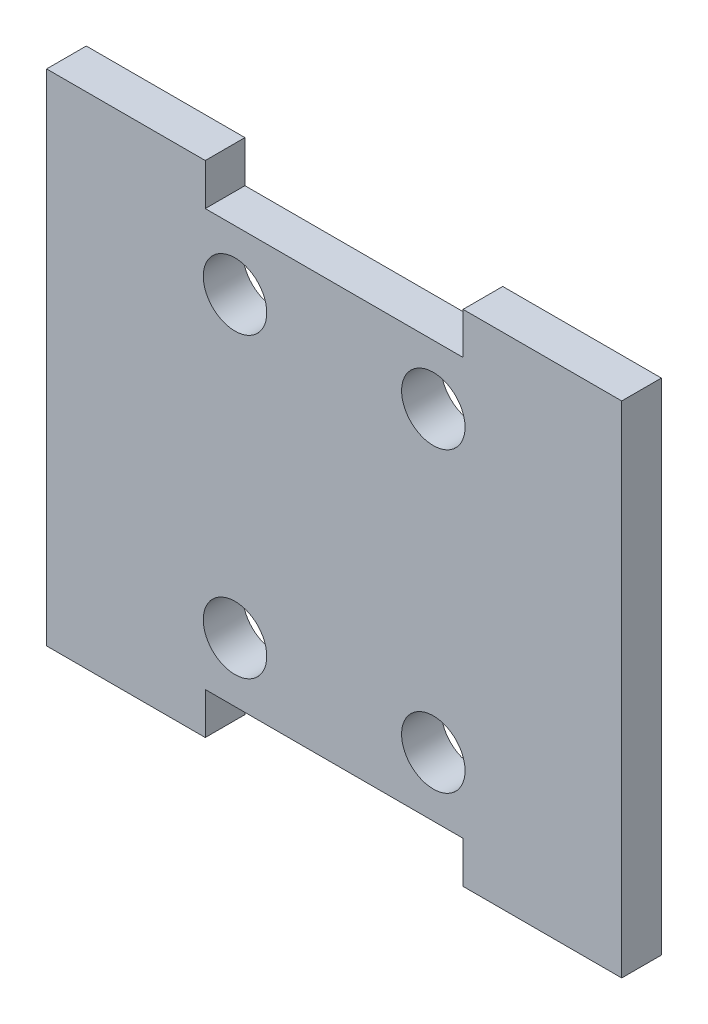
ISO-10303-21;
HEADER;
FILE_DESCRIPTION(('STEP AP214'),'2;1');
FILE_NAME('part.step','',(''),(''),'','','');
FILE_SCHEMA(('AUTOMOTIVE_DESIGN { 1 0 10303 214 1 1 1 1 }'));
ENDSEC;
DATA;
#1=APPLICATION_CONTEXT('core data for automotive mechanical design processes');
#2=APPLICATION_PROTOCOL_DEFINITION('international standard','automotive_design',2000,#1);
#3=PRODUCT_CONTEXT('',#1,'mechanical');
#4=PRODUCT('Part','Part','',(#3));
#5=PRODUCT_RELATED_PRODUCT_CATEGORY('part','',(#4));
#6=PRODUCT_DEFINITION_FORMATION('','',#4);
#7=PRODUCT_DEFINITION_CONTEXT('part definition',#1,'design');
#8=PRODUCT_DEFINITION('design','',#6,#7);
#9=PRODUCT_DEFINITION_SHAPE('','',#8);
#10=(LENGTH_UNIT() NAMED_UNIT(*) SI_UNIT(.MILLI.,.METRE.));
#11=(NAMED_UNIT(*) PLANE_ANGLE_UNIT() SI_UNIT($,.RADIAN.));
#12=(NAMED_UNIT(*) SI_UNIT($,.STERADIAN.) SOLID_ANGLE_UNIT());
#13=UNCERTAINTY_MEASURE_WITH_UNIT(LENGTH_MEASURE(1.E-05),#10,'distance_accuracy_value','');
#14=(GEOMETRIC_REPRESENTATION_CONTEXT(3) GLOBAL_UNCERTAINTY_ASSIGNED_CONTEXT((#13)) GLOBAL_UNIT_ASSIGNED_CONTEXT((#10,
#11,#12)) REPRESENTATION_CONTEXT('',''));
#15=CARTESIAN_POINT('',(0.,0.,0.));
#16=DIRECTION('',(0.,0.,1.));
#17=DIRECTION('',(1.,0.,0.));
#18=AXIS2_PLACEMENT_3D('',#15,#16,#17);
#19=CARTESIAN_POINT('',(0.,10.5,2.));
#20=DIRECTION('',(0.,-1.,0.));
#21=DIRECTION('',(1.,0.,0.));
#22=AXIS2_PLACEMENT_3D('',#19,#20,#21);
#23=PLANE('',#22);
#24=DIRECTION('',(-1.,0.,0.));
#25=VECTOR('',#24,1.);
#26=CARTESIAN_POINT('',(0.,10.5,0.));
#27=LINE('',#26,#25);
#28=CARTESIAN_POINT('',(-3.58229785331569,10.5,0.));
#29=VERTEX_POINT('',#28);
#30=CARTESIAN_POINT('',(-16.5822978533157,10.5,0.));
#31=VERTEX_POINT('',#30);
#32=EDGE_CURVE('E189',#29,#31,#27,.T.);
#33=ORIENTED_EDGE('',*,*,#32,.T.);
#34=DIRECTION('',(0.,0.,-1.));
#35=VECTOR('',#34,1.);
#36=CARTESIAN_POINT('',(-16.5822978533157,10.5,2.));
#37=LINE('',#36,#35);
#38=CARTESIAN_POINT('',(-16.5822978533157,10.5,2.));
#39=VERTEX_POINT('',#38);
#40=EDGE_CURVE('E11',#39,#31,#37,.T.);
#41=ORIENTED_EDGE('',*,*,#40,.F.);
#42=DIRECTION('',(-1.,0.,0.));
#43=VECTOR('',#42,1.);
#44=CARTESIAN_POINT('',(0.,10.5,2.));
#45=LINE('',#44,#43);
#46=CARTESIAN_POINT('',(-3.58229785331569,10.5,2.));
#47=VERTEX_POINT('',#46);
#48=EDGE_CURVE('E565',#47,#39,#45,.T.);
#49=ORIENTED_EDGE('',*,*,#48,.F.);
#50=DIRECTION('',(0.,0.,-1.));
#51=VECTOR('',#50,1.);
#52=CARTESIAN_POINT('',(-3.58229785331569,10.5,2.));
#53=LINE('',#52,#51);
#54=EDGE_CURVE('E63',#47,#29,#53,.T.);
#55=ORIENTED_EDGE('',*,*,#54,.T.);
#56=EDGE_LOOP('',(#33,#41,#49,#55));
#57=FACE_BOUND('',#56,.T.);
#58=ADVANCED_FACE('F45',(#57),#23,.F.);
#59=CARTESIAN_POINT('',(-16.5822978533157,0.,2.));
#60=DIRECTION('',(-1.,0.,0.));
#61=DIRECTION('',(0.,0.,1.));
#62=AXIS2_PLACEMENT_3D('',#59,#60,#61);
#63=PLANE('',#62);
#64=DIRECTION('',(0.,1.,0.));
#65=VECTOR('',#64,1.);
#66=CARTESIAN_POINT('',(-16.5822978533157,0.,0.));
#67=LINE('',#66,#65);
#68=CARTESIAN_POINT('',(-16.5822978533157,12.6,0.));
#69=VERTEX_POINT('',#68);
#70=EDGE_CURVE('E192',#31,#69,#67,.T.);
#71=ORIENTED_EDGE('',*,*,#70,.T.);
#72=DIRECTION('',(0.,0.,-1.));
#73=VECTOR('',#72,1.);
#74=CARTESIAN_POINT('',(-16.5822978533157,12.6,2.));
#75=LINE('',#74,#73);
#76=CARTESIAN_POINT('',(-16.5822978533157,12.6,2.));
#77=VERTEX_POINT('',#76);
#78=EDGE_CURVE('E55',#77,#69,#75,.T.);
#79=ORIENTED_EDGE('',*,*,#78,.F.);
#80=DIRECTION('',(0.,1.,0.));
#81=VECTOR('',#80,1.);
#82=CARTESIAN_POINT('',(-16.5822978533157,0.,2.));
#83=LINE('',#82,#81);
#84=EDGE_CURVE('E113',#39,#77,#83,.T.);
#85=ORIENTED_EDGE('',*,*,#84,.F.);
#86=ORIENTED_EDGE('',*,*,#40,.T.);
#87=EDGE_LOOP('',(#71,#79,#85,#86));
#88=FACE_BOUND('',#87,.T.);
#89=ADVANCED_FACE('F327',(#88),#63,.F.);
#90=CARTESIAN_POINT('',(0.,12.6,2.));
#91=DIRECTION('',(0.,-1.,0.));
#92=DIRECTION('',(0.,0.,-1.));
#93=AXIS2_PLACEMENT_3D('',#90,#91,#92);
#94=PLANE('',#93);
#95=DIRECTION('',(-1.,0.,0.));
#96=VECTOR('',#95,1.);
#97=CARTESIAN_POINT('',(0.,12.6,0.));
#98=LINE('',#97,#96);
#99=CARTESIAN_POINT('',(-24.5822978533157,12.6,0.));
#100=VERTEX_POINT('',#99);
#101=EDGE_CURVE('E195',#69,#100,#98,.T.);
#102=ORIENTED_EDGE('',*,*,#101,.T.);
#103=DIRECTION('',(0.,0.,-1.));
#104=VECTOR('',#103,1.);
#105=CARTESIAN_POINT('',(-24.5822978533157,12.6,2.));
#106=LINE('',#105,#104);
#107=CARTESIAN_POINT('',(-24.5822978533157,12.6,2.));
#108=VERTEX_POINT('',#107);
#109=EDGE_CURVE('E260',#108,#100,#106,.T.);
#110=ORIENTED_EDGE('',*,*,#109,.F.);
#111=DIRECTION('',(-1.,0.,0.));
#112=VECTOR('',#111,1.);
#113=CARTESIAN_POINT('',(0.,12.6,2.));
#114=LINE('',#113,#112);
#115=EDGE_CURVE('E270',#77,#108,#114,.T.);
#116=ORIENTED_EDGE('',*,*,#115,.F.);
#117=ORIENTED_EDGE('',*,*,#78,.T.);
#118=EDGE_LOOP('',(#102,#110,#116,#117));
#119=FACE_BOUND('',#118,.T.);
#120=ADVANCED_FACE('F268',(#119),#94,.F.);
#121=CARTESIAN_POINT('',(-24.5822978533157,0.,2.));
#122=DIRECTION('',(1.,0.,0.));
#123=DIRECTION('',(0.,0.,-1.));
#124=AXIS2_PLACEMENT_3D('',#121,#122,#123);
#125=PLANE('',#124);
#126=DIRECTION('',(0.,-1.,0.));
#127=VECTOR('',#126,1.);
#128=CARTESIAN_POINT('',(-24.5822978533157,0.,0.));
#129=LINE('',#128,#127);
#130=CARTESIAN_POINT('',(-24.5822978533157,-12.6,0.));
#131=VERTEX_POINT('',#130);
#132=EDGE_CURVE('E198',#100,#131,#129,.T.);
#133=ORIENTED_EDGE('',*,*,#132,.T.);
#134=DIRECTION('',(0.,0.,-1.));
#135=VECTOR('',#134,1.);
#136=CARTESIAN_POINT('',(-24.5822978533157,-12.6,2.));
#137=LINE('',#136,#135);
#138=CARTESIAN_POINT('',(-24.5822978533157,-12.6,2.));
#139=VERTEX_POINT('',#138);
#140=EDGE_CURVE('E257',#139,#131,#137,.T.);
#141=ORIENTED_EDGE('',*,*,#140,.F.);
#142=DIRECTION('',(0.,-1.,0.));
#143=VECTOR('',#142,1.);
#144=CARTESIAN_POINT('',(-24.5822978533157,0.,2.));
#145=LINE('',#144,#143);
#146=EDGE_CURVE('E281',#108,#139,#145,.T.);
#147=ORIENTED_EDGE('',*,*,#146,.F.);
#148=ORIENTED_EDGE('',*,*,#109,.T.);
#149=EDGE_LOOP('',(#133,#141,#147,#148));
#150=FACE_BOUND('',#149,.T.);
#151=ADVANCED_FACE('F278',(#150),#125,.F.);
#152=CARTESIAN_POINT('',(0.,-12.6,2.));
#153=DIRECTION('',(0.,-1.,0.));
#154=DIRECTION('',(0.,0.,-1.));
#155=AXIS2_PLACEMENT_3D('',#152,#153,#154);
#156=PLANE('',#155);
#157=DIRECTION('',(-1.,0.,0.));
#158=VECTOR('',#157,1.);
#159=CARTESIAN_POINT('',(0.,-12.6,0.));
#160=LINE('',#159,#158);
#161=CARTESIAN_POINT('',(-16.5822978533157,-12.6,0.));
#162=VERTEX_POINT('',#161);
#163=EDGE_CURVE('E202',#162,#131,#160,.T.);
#164=ORIENTED_EDGE('',*,*,#163,.F.);
#165=DIRECTION('',(0.,0.,-1.));
#166=VECTOR('',#165,1.);
#167=CARTESIAN_POINT('',(-16.5822978533157,-12.6,2.));
#168=LINE('',#167,#166);
#169=CARTESIAN_POINT('',(-16.5822978533157,-12.6,2.));
#170=VERTEX_POINT('',#169);
#171=EDGE_CURVE('E254',#170,#162,#168,.T.);
#172=ORIENTED_EDGE('',*,*,#171,.F.);
#173=DIRECTION('',(-1.,0.,0.));
#174=VECTOR('',#173,1.);
#175=CARTESIAN_POINT('',(0.,-12.6,2.));
#176=LINE('',#175,#174);
#177=EDGE_CURVE('E284',#170,#139,#176,.T.);
#178=ORIENTED_EDGE('',*,*,#177,.T.);
#179=ORIENTED_EDGE('',*,*,#140,.T.);
#180=EDGE_LOOP('',(#164,#172,#178,#179));
#181=FACE_BOUND('',#180,.T.);
#182=ADVANCED_FACE('F338',(#181),#156,.T.);
#183=CARTESIAN_POINT('',(-16.5822978533157,0.,2.));
#184=DIRECTION('',(1.,0.,0.));
#185=DIRECTION('',(0.,0.,-1.));
#186=AXIS2_PLACEMENT_3D('',#183,#184,#185);
#187=PLANE('',#186);
#188=DIRECTION('',(0.,-1.,0.));
#189=VECTOR('',#188,1.);
#190=CARTESIAN_POINT('',(-16.5822978533157,0.,0.));
#191=LINE('',#190,#189);
#192=CARTESIAN_POINT('',(-16.5822978533157,-10.5,0.));
#193=VERTEX_POINT('',#192);
#194=EDGE_CURVE('E206',#193,#162,#191,.T.);
#195=ORIENTED_EDGE('',*,*,#194,.F.);
#196=DIRECTION('',(0.,0.,-1.));
#197=VECTOR('',#196,1.);
#198=CARTESIAN_POINT('',(-16.5822978533157,-10.5,2.));
#199=LINE('',#198,#197);
#200=CARTESIAN_POINT('',(-16.5822978533157,-10.5,2.));
#201=VERTEX_POINT('',#200);
#202=EDGE_CURVE('E251',#201,#193,#199,.T.);
#203=ORIENTED_EDGE('',*,*,#202,.F.);
#204=DIRECTION('',(0.,-1.,0.));
#205=VECTOR('',#204,1.);
#206=CARTESIAN_POINT('',(-16.5822978533157,0.,2.));
#207=LINE('',#206,#205);
#208=EDGE_CURVE('E288',#201,#170,#207,.T.);
#209=ORIENTED_EDGE('',*,*,#208,.T.);
#210=ORIENTED_EDGE('',*,*,#171,.T.);
#211=EDGE_LOOP('',(#195,#203,#209,#210));
#212=FACE_BOUND('',#211,.T.);
#213=ADVANCED_FACE('F341',(#212),#187,.T.);
#214=CARTESIAN_POINT('',(0.,-10.5,2.));
#215=DIRECTION('',(0.,1.,0.));
#216=DIRECTION('',(0.,0.,1.));
#217=AXIS2_PLACEMENT_3D('',#214,#215,#216);
#218=PLANE('',#217);
#219=DIRECTION('',(1.,0.,0.));
#220=VECTOR('',#219,1.);
#221=CARTESIAN_POINT('',(0.,-10.5,0.));
#222=LINE('',#221,#220);
#223=CARTESIAN_POINT('',(-3.58229785331569,-10.5,0.));
#224=VERTEX_POINT('',#223);
#225=EDGE_CURVE('E210',#193,#224,#222,.T.);
#226=ORIENTED_EDGE('',*,*,#225,.T.);
#227=DIRECTION('',(0.,0.,-1.));
#228=VECTOR('',#227,1.);
#229=CARTESIAN_POINT('',(-3.58229785331569,-10.5,2.));
#230=LINE('',#229,#228);
#231=CARTESIAN_POINT('',(-3.58229785331569,-10.5,2.));
#232=VERTEX_POINT('',#231);
#233=EDGE_CURVE('E247',#232,#224,#230,.T.);
#234=ORIENTED_EDGE('',*,*,#233,.F.);
#235=DIRECTION('',(1.,0.,0.));
#236=VECTOR('',#235,1.);
#237=CARTESIAN_POINT('',(0.,-10.5,2.));
#238=LINE('',#237,#236);
#239=EDGE_CURVE('E296',#201,#232,#238,.T.);
#240=ORIENTED_EDGE('',*,*,#239,.F.);
#241=ORIENTED_EDGE('',*,*,#202,.T.);
#242=EDGE_LOOP('',(#226,#234,#240,#241));
#243=FACE_BOUND('',#242,.T.);
#244=ADVANCED_FACE('F345',(#243),#218,.F.);
#245=CARTESIAN_POINT('',(-3.58229785331571,0.,2.));
#246=DIRECTION('',(1.,0.,0.));
#247=DIRECTION('',(0.,1.,0.));
#248=AXIS2_PLACEMENT_3D('',#245,#246,#247);
#249=PLANE('',#248);
#250=DIRECTION('',(0.,-1.,0.));
#251=VECTOR('',#250,1.);
#252=CARTESIAN_POINT('',(-3.58229785331571,0.,0.));
#253=LINE('',#252,#251);
#254=CARTESIAN_POINT('',(-3.58229785331569,-12.6,0.));
#255=VERTEX_POINT('',#254);
#256=EDGE_CURVE('E213',#224,#255,#253,.T.);
#257=ORIENTED_EDGE('',*,*,#256,.T.);
#258=DIRECTION('',(0.,0.,-1.));
#259=VECTOR('',#258,1.);
#260=CARTESIAN_POINT('',(-3.58229785331569,-12.6,2.));
#261=LINE('',#260,#259);
#262=CARTESIAN_POINT('',(-3.58229785331569,-12.6,2.));
#263=VERTEX_POINT('',#262);
#264=EDGE_CURVE('E243',#263,#255,#261,.T.);
#265=ORIENTED_EDGE('',*,*,#264,.F.);
#266=DIRECTION('',(0.,-1.,0.));
#267=VECTOR('',#266,1.);
#268=CARTESIAN_POINT('',(-3.58229785331571,0.,2.));
#269=LINE('',#268,#267);
#270=EDGE_CURVE('E299',#232,#263,#269,.T.);
#271=ORIENTED_EDGE('',*,*,#270,.F.);
#272=ORIENTED_EDGE('',*,*,#233,.T.);
#273=EDGE_LOOP('',(#257,#265,#271,#272));
#274=FACE_BOUND('',#273,.T.);
#275=ADVANCED_FACE('F308',(#274),#249,.F.);
#276=CARTESIAN_POINT('',(0.,-12.6,2.));
#277=DIRECTION('',(0.,1.,0.));
#278=DIRECTION('',(0.,0.,1.));
#279=AXIS2_PLACEMENT_3D('',#276,#277,#278);
#280=PLANE('',#279);
#281=DIRECTION('',(1.,0.,0.));
#282=VECTOR('',#281,1.);
#283=CARTESIAN_POINT('',(0.,-12.6,0.));
#284=LINE('',#283,#282);
#285=CARTESIAN_POINT('',(4.41770214668431,-12.6,0.));
#286=VERTEX_POINT('',#285);
#287=EDGE_CURVE('E216',#255,#286,#284,.T.);
#288=ORIENTED_EDGE('',*,*,#287,.T.);
#289=DIRECTION('',(0.,0.,-1.));
#290=VECTOR('',#289,1.);
#291=CARTESIAN_POINT('',(4.41770214668431,-12.6,2.));
#292=LINE('',#291,#290);
#293=CARTESIAN_POINT('',(4.41770214668431,-12.6,2.));
#294=VERTEX_POINT('',#293);
#295=EDGE_CURVE('E163',#294,#286,#292,.T.);
#296=ORIENTED_EDGE('',*,*,#295,.F.);
#297=DIRECTION('',(1.,0.,0.));
#298=VECTOR('',#297,1.);
#299=CARTESIAN_POINT('',(0.,-12.6,2.));
#300=LINE('',#299,#298);
#301=EDGE_CURVE('E149',#263,#294,#300,.T.);
#302=ORIENTED_EDGE('',*,*,#301,.F.);
#303=ORIENTED_EDGE('',*,*,#264,.T.);
#304=EDGE_LOOP('',(#288,#296,#302,#303));
#305=FACE_BOUND('',#304,.T.);
#306=ADVANCED_FACE('F312',(#305),#280,.F.);
#307=CARTESIAN_POINT('',(4.41770214668431,0.,2.));
#308=DIRECTION('',(-1.,0.,0.));
#309=DIRECTION('',(0.,0.,1.));
#310=AXIS2_PLACEMENT_3D('',#307,#308,#309);
#311=PLANE('',#310);
#312=DIRECTION('',(0.,1.,0.));
#313=VECTOR('',#312,1.);
#314=CARTESIAN_POINT('',(4.41770214668431,0.,0.));
#315=LINE('',#314,#313);
#316=CARTESIAN_POINT('',(4.41770214668431,12.6,0.));
#317=VERTEX_POINT('',#316);
#318=EDGE_CURVE('E159',#286,#317,#315,.T.);
#319=ORIENTED_EDGE('',*,*,#318,.T.);
#320=DIRECTION('',(0.,0.,-1.));
#321=VECTOR('',#320,1.);
#322=CARTESIAN_POINT('',(4.41770214668431,12.6,2.));
#323=LINE('',#322,#321);
#324=CARTESIAN_POINT('',(4.41770214668431,12.6,2.));
#325=VERTEX_POINT('',#324);
#326=EDGE_CURVE('E156',#325,#317,#323,.T.);
#327=ORIENTED_EDGE('',*,*,#326,.F.);
#328=DIRECTION('',(0.,1.,0.));
#329=VECTOR('',#328,1.);
#330=CARTESIAN_POINT('',(4.41770214668431,0.,2.));
#331=LINE('',#330,#329);
#332=EDGE_CURVE('E141',#294,#325,#331,.T.);
#333=ORIENTED_EDGE('',*,*,#332,.F.);
#334=ORIENTED_EDGE('',*,*,#295,.T.);
#335=EDGE_LOOP('',(#319,#327,#333,#334));
#336=FACE_BOUND('',#335,.T.);
#337=ADVANCED_FACE('F157',(#336),#311,.F.);
#338=CARTESIAN_POINT('',(0.,12.6,2.));
#339=DIRECTION('',(0.,1.,0.));
#340=DIRECTION('',(0.,0.,1.));
#341=AXIS2_PLACEMENT_3D('',#338,#339,#340);
#342=PLANE('',#341);
#343=DIRECTION('',(1.,0.,0.));
#344=VECTOR('',#343,1.);
#345=CARTESIAN_POINT('',(0.,12.6,0.));
#346=LINE('',#345,#344);
#347=CARTESIAN_POINT('',(-3.58229785331569,12.6,0.));
#348=VERTEX_POINT('',#347);
#349=EDGE_CURVE('E221',#348,#317,#346,.T.);
#350=ORIENTED_EDGE('',*,*,#349,.F.);
#351=DIRECTION('',(0.,0.,-1.));
#352=VECTOR('',#351,1.);
#353=CARTESIAN_POINT('',(-3.58229785331569,12.6,2.));
#354=LINE('',#353,#352);
#355=CARTESIAN_POINT('',(-3.58229785331569,12.6,2.));
#356=VERTEX_POINT('',#355);
#357=EDGE_CURVE('E101',#356,#348,#354,.T.);
#358=ORIENTED_EDGE('',*,*,#357,.F.);
#359=DIRECTION('',(1.,0.,0.));
#360=VECTOR('',#359,1.);
#361=CARTESIAN_POINT('',(0.,12.6,2.));
#362=LINE('',#361,#360);
#363=EDGE_CURVE('E147',#356,#325,#362,.T.);
#364=ORIENTED_EDGE('',*,*,#363,.T.);
#365=ORIENTED_EDGE('',*,*,#326,.T.);
#366=EDGE_LOOP('',(#350,#358,#364,#365));
#367=FACE_BOUND('',#366,.T.);
#368=ADVANCED_FACE('F165',(#367),#342,.T.);
#369=CARTESIAN_POINT('',(-15.0822978533157,-7.5,2.));
#370=DIRECTION('',(0.,0.,-1.));
#371=DIRECTION('',(-1.,0.,0.));
#372=AXIS2_PLACEMENT_3D('',#369,#370,#371);
#373=CYLINDRICAL_SURFACE('',#372,1.6);
#374=CARTESIAN_POINT('',(-15.0822978533157,-7.5,2.));
#375=DIRECTION('',(0.,0.,1.));
#376=DIRECTION('',(1.,0.,0.));
#377=AXIS2_PLACEMENT_3D('',#374,#375,#376);
#378=CIRCLE('',#377,1.6);
#379=CARTESIAN_POINT('',(-13.4822978533157,-7.5,2.));
#380=VERTEX_POINT('',#379);
#381=EDGE_CURVE('E170',#380,#380,#378,.T.);
#382=ORIENTED_EDGE('',*,*,#381,.T.);
#383=EDGE_LOOP('',(#382));
#384=FACE_BOUND('',#383,.T.);
#385=CARTESIAN_POINT('',(-15.0822978533157,-7.5,0.));
#386=DIRECTION('',(0.,0.,1.));
#387=DIRECTION('',(1.,0.,0.));
#388=AXIS2_PLACEMENT_3D('',#385,#386,#387);
#389=CIRCLE('',#388,1.6);
#390=CARTESIAN_POINT('',(-13.4822978533157,-7.5,0.));
#391=VERTEX_POINT('',#390);
#392=EDGE_CURVE('E228',#391,#391,#389,.T.);
#393=ORIENTED_EDGE('',*,*,#392,.F.);
#394=EDGE_LOOP('',(#393));
#395=FACE_BOUND('',#394,.T.);
#396=ADVANCED_FACE('F316',(#384,#395),#373,.F.);
#397=CARTESIAN_POINT('',(-3.58229785331571,0.,2.));
#398=DIRECTION('',(-1.,0.,0.));
#399=DIRECTION('',(0.,-1.,0.));
#400=AXIS2_PLACEMENT_3D('',#397,#398,#399);
#401=PLANE('',#400);
#402=DIRECTION('',(0.,1.,0.));
#403=VECTOR('',#402,1.);
#404=CARTESIAN_POINT('',(-3.58229785331571,0.,0.));
#405=LINE('',#404,#403);
#406=EDGE_CURVE('E224',#29,#348,#405,.T.);
#407=ORIENTED_EDGE('',*,*,#406,.F.);
#408=ORIENTED_EDGE('',*,*,#54,.F.);
#409=DIRECTION('',(0.,1.,0.));
#410=VECTOR('',#409,1.);
#411=CARTESIAN_POINT('',(-3.58229785331571,0.,2.));
#412=LINE('',#411,#410);
#413=EDGE_CURVE('E167',#47,#356,#412,.T.);
#414=ORIENTED_EDGE('',*,*,#413,.T.);
#415=ORIENTED_EDGE('',*,*,#357,.T.);
#416=EDGE_LOOP('',(#407,#408,#414,#415));
#417=FACE_BOUND('',#416,.T.);
#418=ADVANCED_FACE('F313',(#417),#401,.T.);
#419=CARTESIAN_POINT('',(-5.0822978533157,7.5,2.));
#420=DIRECTION('',(0.,0.,-1.));
#421=DIRECTION('',(-1.,0.,0.));
#422=AXIS2_PLACEMENT_3D('',#419,#420,#421);
#423=CYLINDRICAL_SURFACE('',#422,1.6);
#424=CARTESIAN_POINT('',(-5.0822978533157,7.5,2.));
#425=DIRECTION('',(0.,0.,1.));
#426=DIRECTION('',(1.,0.,0.));
#427=AXIS2_PLACEMENT_3D('',#424,#425,#426);
#428=CIRCLE('',#427,1.6);
#429=CARTESIAN_POINT('',(-3.48229785331569,7.5,2.));
#430=VERTEX_POINT('',#429);
#431=EDGE_CURVE('E563',#430,#430,#428,.T.);
#432=ORIENTED_EDGE('',*,*,#431,.T.);
#433=EDGE_LOOP('',(#432));
#434=FACE_BOUND('',#433,.T.);
#435=CARTESIAN_POINT('',(-5.0822978533157,7.5,0.));
#436=DIRECTION('',(0.,0.,1.));
#437=DIRECTION('',(1.,0.,0.));
#438=AXIS2_PLACEMENT_3D('',#435,#436,#437);
#439=CIRCLE('',#438,1.6);
#440=CARTESIAN_POINT('',(-3.48229785331569,7.5,0.));
#441=VERTEX_POINT('',#440);
#442=EDGE_CURVE('E185',#441,#441,#439,.T.);
#443=ORIENTED_EDGE('',*,*,#442,.F.);
#444=EDGE_LOOP('',(#443));
#445=FACE_BOUND('',#444,.T.);
#446=ADVANCED_FACE('F315',(#434,#445),#423,.F.);
#447=CARTESIAN_POINT('',(-15.0822978533157,7.5,2.));
#448=DIRECTION('',(0.,0.,-1.));
#449=DIRECTION('',(-1.,0.,0.));
#450=AXIS2_PLACEMENT_3D('',#447,#448,#449);
#451=CYLINDRICAL_SURFACE('',#450,1.6);
#452=CARTESIAN_POINT('',(-15.0822978533157,7.5,2.));
#453=DIRECTION('',(0.,0.,1.));
#454=DIRECTION('',(1.,0.,0.));
#455=AXIS2_PLACEMENT_3D('',#452,#453,#454);
#456=CIRCLE('',#455,1.6);
#457=CARTESIAN_POINT('',(-13.4822978533157,7.5,2.));
#458=VERTEX_POINT('',#457);
#459=EDGE_CURVE('E236',#458,#458,#456,.F.);
#460=ORIENTED_EDGE('',*,*,#459,.F.);
#461=EDGE_LOOP('',(#460));
#462=FACE_BOUND('',#461,.T.);
#463=CARTESIAN_POINT('',(-15.0822978533157,7.5,0.));
#464=DIRECTION('',(0.,0.,1.));
#465=DIRECTION('',(1.,0.,0.));
#466=AXIS2_PLACEMENT_3D('',#463,#464,#465);
#467=CIRCLE('',#466,1.6);
#468=CARTESIAN_POINT('',(-13.4822978533157,7.5,0.));
#469=VERTEX_POINT('',#468);
#470=EDGE_CURVE('E181',#469,#469,#467,.F.);
#471=ORIENTED_EDGE('',*,*,#470,.T.);
#472=EDGE_LOOP('',(#471));
#473=FACE_BOUND('',#472,.T.);
#474=ADVANCED_FACE('F47',(#462,#473),#451,.F.);
#475=CARTESIAN_POINT('',(-5.0822978533157,-7.5,2.));
#476=DIRECTION('',(0.,0.,-1.));
#477=DIRECTION('',(-1.,0.,0.));
#478=AXIS2_PLACEMENT_3D('',#475,#476,#477);
#479=CYLINDRICAL_SURFACE('',#478,1.6);
#480=CARTESIAN_POINT('',(-5.0822978533157,-7.5,2.));
#481=DIRECTION('',(0.,0.,1.));
#482=DIRECTION('',(1.,0.,0.));
#483=AXIS2_PLACEMENT_3D('',#480,#481,#482);
#484=CIRCLE('',#483,1.6);
#485=CARTESIAN_POINT('',(-3.48229785331569,-7.5,2.));
#486=VERTEX_POINT('',#485);
#487=EDGE_CURVE('E177',#486,#486,#484,.F.);
#488=ORIENTED_EDGE('',*,*,#487,.F.);
#489=EDGE_LOOP('',(#488));
#490=FACE_BOUND('',#489,.T.);
#491=CARTESIAN_POINT('',(-5.0822978533157,-7.5,0.));
#492=DIRECTION('',(0.,0.,1.));
#493=DIRECTION('',(1.,0.,0.));
#494=AXIS2_PLACEMENT_3D('',#491,#492,#493);
#495=CIRCLE('',#494,1.6);
#496=CARTESIAN_POINT('',(-3.48229785331569,-7.5,0.));
#497=VERTEX_POINT('',#496);
#498=EDGE_CURVE('E232',#497,#497,#495,.F.);
#499=ORIENTED_EDGE('',*,*,#498,.T.);
#500=EDGE_LOOP('',(#499));
#501=FACE_BOUND('',#500,.T.);
#502=ADVANCED_FACE('F386',(#490,#501),#479,.F.);
#503=CARTESIAN_POINT('',(0.,0.,2.));
#504=DIRECTION('',(0.,0.,1.));
#505=DIRECTION('',(1.,0.,0.));
#506=AXIS2_PLACEMENT_3D('',#503,#504,#505);
#507=PLANE('',#506);
#508=ORIENTED_EDGE('',*,*,#459,.T.);
#509=EDGE_LOOP('',(#508));
#510=FACE_BOUND('',#509,.T.);
#511=ORIENTED_EDGE('',*,*,#431,.F.);
#512=EDGE_LOOP('',(#511));
#513=FACE_BOUND('',#512,.T.);
#514=ORIENTED_EDGE('',*,*,#48,.T.);
#515=ORIENTED_EDGE('',*,*,#84,.T.);
#516=ORIENTED_EDGE('',*,*,#115,.T.);
#517=ORIENTED_EDGE('',*,*,#146,.T.);
#518=ORIENTED_EDGE('',*,*,#177,.F.);
#519=ORIENTED_EDGE('',*,*,#208,.F.);
#520=ORIENTED_EDGE('',*,*,#239,.T.);
#521=ORIENTED_EDGE('',*,*,#270,.T.);
#522=ORIENTED_EDGE('',*,*,#301,.T.);
#523=ORIENTED_EDGE('',*,*,#332,.T.);
#524=ORIENTED_EDGE('',*,*,#363,.F.);
#525=ORIENTED_EDGE('',*,*,#413,.F.);
#526=EDGE_LOOP('',(#514,#515,#516,#517,#518,#519,#520,#521,#522,#523,#524,#525));
#527=FACE_BOUND('',#526,.T.);
#528=ORIENTED_EDGE('',*,*,#381,.F.);
#529=EDGE_LOOP('',(#528));
#530=FACE_BOUND('',#529,.T.);
#531=ORIENTED_EDGE('',*,*,#487,.T.);
#532=EDGE_LOOP('',(#531));
#533=FACE_BOUND('',#532,.T.);
#534=ADVANCED_FACE('F143',(#510,#513,#527,#530,#533),#507,.T.);
#535=CARTESIAN_POINT('',(0.,0.,0.));
#536=DIRECTION('',(0.,0.,1.));
#537=DIRECTION('',(1.,0.,0.));
#538=AXIS2_PLACEMENT_3D('',#535,#536,#537);
#539=PLANE('',#538);
#540=ORIENTED_EDGE('',*,*,#470,.F.);
#541=EDGE_LOOP('',(#540));
#542=FACE_BOUND('',#541,.T.);
#543=ORIENTED_EDGE('',*,*,#442,.T.);
#544=EDGE_LOOP('',(#543));
#545=FACE_BOUND('',#544,.T.);
#546=ORIENTED_EDGE('',*,*,#32,.F.);
#547=ORIENTED_EDGE('',*,*,#406,.T.);
#548=ORIENTED_EDGE('',*,*,#349,.T.);
#549=ORIENTED_EDGE('',*,*,#318,.F.);
#550=ORIENTED_EDGE('',*,*,#287,.F.);
#551=ORIENTED_EDGE('',*,*,#256,.F.);
#552=ORIENTED_EDGE('',*,*,#225,.F.);
#553=ORIENTED_EDGE('',*,*,#194,.T.);
#554=ORIENTED_EDGE('',*,*,#163,.T.);
#555=ORIENTED_EDGE('',*,*,#132,.F.);
#556=ORIENTED_EDGE('',*,*,#101,.F.);
#557=ORIENTED_EDGE('',*,*,#70,.F.);
#558=EDGE_LOOP('',(#546,#547,#548,#549,#550,#551,#552,#553,#554,#555,#556,#557));
#559=FACE_BOUND('',#558,.T.);
#560=ORIENTED_EDGE('',*,*,#392,.T.);
#561=EDGE_LOOP('',(#560));
#562=FACE_BOUND('',#561,.T.);
#563=ORIENTED_EDGE('',*,*,#498,.F.);
#564=EDGE_LOOP('',(#563));
#565=FACE_BOUND('',#564,.T.);
#566=ADVANCED_FACE('F273',(#542,#545,#559,#562,#565),#539,.F.);
#567=CLOSED_SHELL('',(#58,#89,#120,#151,#182,#213,#244,#275,#306,#337,#368,#396,#418,#446,#474,
#502,#534,#566));
#568=MANIFOLD_SOLID_BREP('B2',#567);
#569=ADVANCED_BREP_SHAPE_REPRESENTATION('',(#18,#568),#14);
#570=SHAPE_DEFINITION_REPRESENTATION(#9,#569);
ENDSEC;
END-ISO-10303-21;
